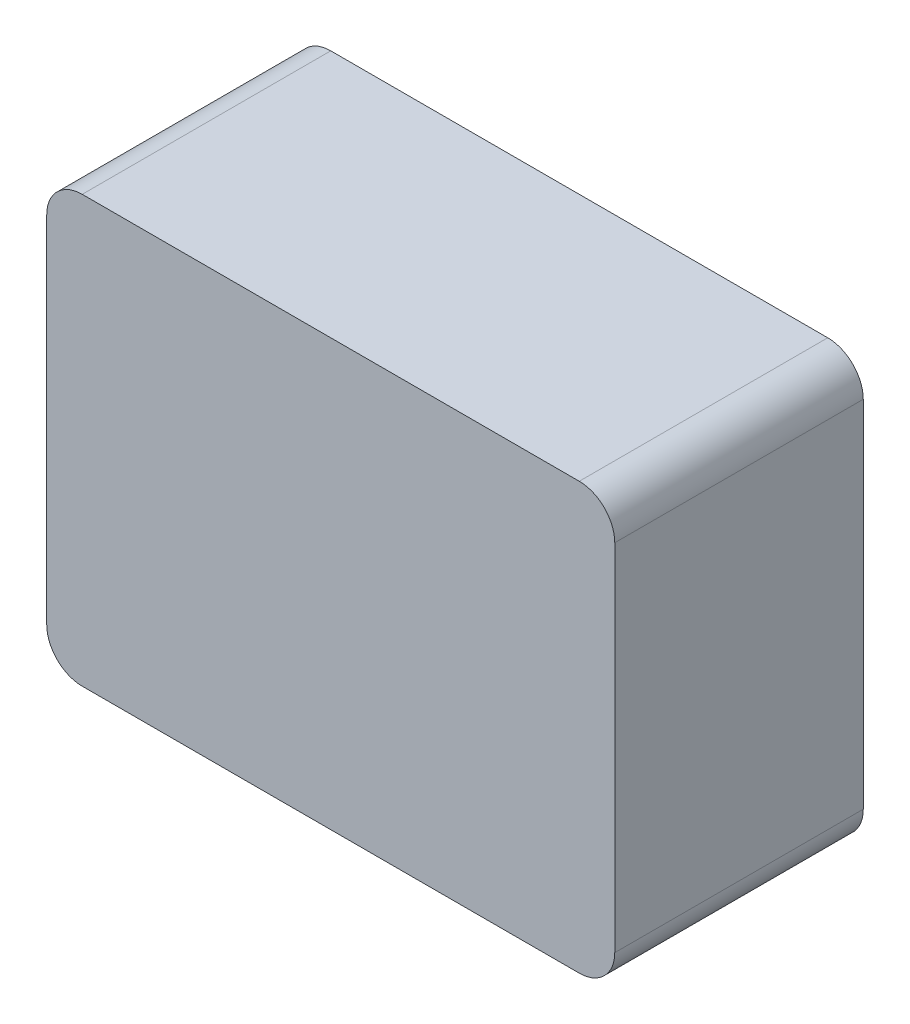
ISO-10303-21;
HEADER;
FILE_DESCRIPTION(('STEP AP214'),'2;1');
FILE_NAME('part.step','',(''),(''),'','','');
FILE_SCHEMA(('AUTOMOTIVE_DESIGN { 1 0 10303 214 1 1 1 1 }'));
ENDSEC;
DATA;
#1=APPLICATION_CONTEXT('core data for automotive mechanical design processes');
#2=APPLICATION_PROTOCOL_DEFINITION('international standard','automotive_design',2000,#1);
#3=PRODUCT_CONTEXT('',#1,'mechanical');
#4=PRODUCT('Part','Part','',(#3));
#5=PRODUCT_RELATED_PRODUCT_CATEGORY('part','',(#4));
#6=PRODUCT_DEFINITION_FORMATION('','',#4);
#7=PRODUCT_DEFINITION_CONTEXT('part definition',#1,'design');
#8=PRODUCT_DEFINITION('design','',#6,#7);
#9=PRODUCT_DEFINITION_SHAPE('','',#8);
#10=(LENGTH_UNIT() NAMED_UNIT(*) SI_UNIT(.MILLI.,.METRE.));
#11=(NAMED_UNIT(*) PLANE_ANGLE_UNIT() SI_UNIT($,.RADIAN.));
#12=(NAMED_UNIT(*) SI_UNIT($,.STERADIAN.) SOLID_ANGLE_UNIT());
#13=UNCERTAINTY_MEASURE_WITH_UNIT(LENGTH_MEASURE(1.E-05),#10,'distance_accuracy_value','');
#14=(GEOMETRIC_REPRESENTATION_CONTEXT(3) GLOBAL_UNCERTAINTY_ASSIGNED_CONTEXT((#13)) GLOBAL_UNIT_ASSIGNED_CONTEXT((#10,
#11,#12)) REPRESENTATION_CONTEXT('',''));
#15=CARTESIAN_POINT('',(0.,0.,0.));
#16=DIRECTION('',(0.,0.,1.));
#17=DIRECTION('',(1.,0.,0.));
#18=AXIS2_PLACEMENT_3D('',#15,#16,#17);
#19=CARTESIAN_POINT('',(40.,-30.,-5.));
#20=DIRECTION('',(1.,0.,0.));
#21=DIRECTION('',(0.,0.,-1.));
#22=AXIS2_PLACEMENT_3D('',#19,#20,#21);
#23=PLANE('',#22);
#24=DIRECTION('',(0.,-1.,0.));
#25=VECTOR('',#24,1.);
#26=CARTESIAN_POINT('',(40.,-30.,-35.));
#27=LINE('',#26,#25);
#28=CARTESIAN_POINT('',(40.,25.,-35.));
#29=VERTEX_POINT('',#28);
#30=CARTESIAN_POINT('',(40.,-25.,-35.));
#31=VERTEX_POINT('',#30);
#32=EDGE_CURVE('E170',#29,#31,#27,.T.);
#33=ORIENTED_EDGE('',*,*,#32,.F.);
#34=DIRECTION('',(0.,0.,1.));
#35=VECTOR('',#34,1.);
#36=CARTESIAN_POINT('',(40.,25.,-5.));
#37=LINE('',#36,#35);
#38=CARTESIAN_POINT('',(40.,25.,0.));
#39=VERTEX_POINT('',#38);
#40=EDGE_CURVE('E11',#29,#39,#37,.T.);
#41=ORIENTED_EDGE('',*,*,#40,.T.);
#42=DIRECTION('',(0.,1.,0.));
#43=VECTOR('',#42,1.);
#44=CARTESIAN_POINT('',(40.,-30.,0.));
#45=LINE('',#44,#43);
#46=CARTESIAN_POINT('',(40.,-25.,0.));
#47=VERTEX_POINT('',#46);
#48=EDGE_CURVE('E175',#47,#39,#45,.T.);
#49=ORIENTED_EDGE('',*,*,#48,.F.);
#50=DIRECTION('',(0.,0.,1.));
#51=VECTOR('',#50,1.);
#52=CARTESIAN_POINT('',(40.,-25.,-5.));
#53=LINE('',#52,#51);
#54=EDGE_CURVE('E41',#47,#31,#53,.F.);
#55=ORIENTED_EDGE('',*,*,#54,.T.);
#56=EDGE_LOOP('',(#33,#41,#49,#55));
#57=FACE_BOUND('',#56,.T.);
#58=ADVANCED_FACE('F33',(#57),#23,.T.);
#59=CARTESIAN_POINT('',(-40.,-30.,-5.));
#60=DIRECTION('',(0.,-1.,0.));
#61=DIRECTION('',(0.,0.,-1.));
#62=AXIS2_PLACEMENT_3D('',#59,#60,#61);
#63=PLANE('',#62);
#64=DIRECTION('',(1.,0.,0.));
#65=VECTOR('',#64,1.);
#66=CARTESIAN_POINT('',(-40.,-30.,0.));
#67=LINE('',#66,#65);
#68=CARTESIAN_POINT('',(-35.,-30.,0.));
#69=VERTEX_POINT('',#68);
#70=CARTESIAN_POINT('',(35.,-30.,0.));
#71=VERTEX_POINT('',#70);
#72=EDGE_CURVE('E184',#69,#71,#67,.T.);
#73=ORIENTED_EDGE('',*,*,#72,.F.);
#74=DIRECTION('',(0.,0.,1.));
#75=VECTOR('',#74,1.);
#76=CARTESIAN_POINT('',(-35.,-30.,-5.));
#77=LINE('',#76,#75);
#78=CARTESIAN_POINT('',(-35.,-30.,-35.));
#79=VERTEX_POINT('',#78);
#80=EDGE_CURVE('E203',#69,#79,#77,.F.);
#81=ORIENTED_EDGE('',*,*,#80,.T.);
#82=DIRECTION('',(-1.,0.,0.));
#83=VECTOR('',#82,1.);
#84=CARTESIAN_POINT('',(-40.,-30.,-35.));
#85=LINE('',#84,#83);
#86=CARTESIAN_POINT('',(35.,-30.,-35.));
#87=VERTEX_POINT('',#86);
#88=EDGE_CURVE('E172',#87,#79,#85,.T.);
#89=ORIENTED_EDGE('',*,*,#88,.F.);
#90=DIRECTION('',(0.,0.,1.));
#91=VECTOR('',#90,1.);
#92=CARTESIAN_POINT('',(35.,-30.,-5.));
#93=LINE('',#92,#91);
#94=EDGE_CURVE('E200',#87,#71,#93,.T.);
#95=ORIENTED_EDGE('',*,*,#94,.T.);
#96=EDGE_LOOP('',(#73,#81,#89,#95));
#97=FACE_BOUND('',#96,.T.);
#98=ADVANCED_FACE('F236',(#97),#63,.T.);
#99=CARTESIAN_POINT('',(-40.,-30.,-5.));
#100=DIRECTION('',(-1.,0.,0.));
#101=DIRECTION('',(0.,0.,1.));
#102=AXIS2_PLACEMENT_3D('',#99,#100,#101);
#103=PLANE('',#102);
#104=DIRECTION('',(0.,1.,0.));
#105=VECTOR('',#104,1.);
#106=CARTESIAN_POINT('',(-40.,30.,-35.));
#107=LINE('',#106,#105);
#108=CARTESIAN_POINT('',(-40.,-25.,-35.));
#109=VERTEX_POINT('',#108);
#110=CARTESIAN_POINT('',(-40.,25.,-35.));
#111=VERTEX_POINT('',#110);
#112=EDGE_CURVE('E143',#109,#111,#107,.T.);
#113=ORIENTED_EDGE('',*,*,#112,.F.);
#114=DIRECTION('',(0.,0.,1.));
#115=VECTOR('',#114,1.);
#116=CARTESIAN_POINT('',(-40.,-25.,-5.));
#117=LINE('',#116,#115);
#118=CARTESIAN_POINT('',(-40.,-25.,0.));
#119=VERTEX_POINT('',#118);
#120=EDGE_CURVE('E189',#109,#119,#117,.T.);
#121=ORIENTED_EDGE('',*,*,#120,.T.);
#122=DIRECTION('',(0.,-1.,0.));
#123=VECTOR('',#122,1.);
#124=CARTESIAN_POINT('',(-40.,-30.,0.));
#125=LINE('',#124,#123);
#126=CARTESIAN_POINT('',(-40.,25.,0.));
#127=VERTEX_POINT('',#126);
#128=EDGE_CURVE('E181',#127,#119,#125,.T.);
#129=ORIENTED_EDGE('',*,*,#128,.F.);
#130=DIRECTION('',(0.,0.,1.));
#131=VECTOR('',#130,1.);
#132=CARTESIAN_POINT('',(-40.,25.,-5.));
#133=LINE('',#132,#131);
#134=EDGE_CURVE('E187',#127,#111,#133,.F.);
#135=ORIENTED_EDGE('',*,*,#134,.T.);
#136=EDGE_LOOP('',(#113,#121,#129,#135));
#137=FACE_BOUND('',#136,.T.);
#138=ADVANCED_FACE('F244',(#137),#103,.T.);
#139=CARTESIAN_POINT('',(-40.,30.,-5.));
#140=DIRECTION('',(0.,1.,0.));
#141=DIRECTION('',(0.,0.,1.));
#142=AXIS2_PLACEMENT_3D('',#139,#140,#141);
#143=PLANE('',#142);
#144=DIRECTION('',(1.,0.,0.));
#145=VECTOR('',#144,1.);
#146=CARTESIAN_POINT('',(40.,30.,-35.));
#147=LINE('',#146,#145);
#148=CARTESIAN_POINT('',(-35.,30.,-35.));
#149=VERTEX_POINT('',#148);
#150=CARTESIAN_POINT('',(35.,30.,-35.));
#151=VERTEX_POINT('',#150);
#152=EDGE_CURVE('E168',#149,#151,#147,.T.);
#153=ORIENTED_EDGE('',*,*,#152,.F.);
#154=DIRECTION('',(0.,0.,1.));
#155=VECTOR('',#154,1.);
#156=CARTESIAN_POINT('',(-35.,30.,-5.));
#157=LINE('',#156,#155);
#158=CARTESIAN_POINT('',(-35.,30.,0.));
#159=VERTEX_POINT('',#158);
#160=EDGE_CURVE('E214',#149,#159,#157,.T.);
#161=ORIENTED_EDGE('',*,*,#160,.T.);
#162=DIRECTION('',(-1.,0.,0.));
#163=VECTOR('',#162,1.);
#164=CARTESIAN_POINT('',(-40.,30.,0.));
#165=LINE('',#164,#163);
#166=CARTESIAN_POINT('',(35.,30.,0.));
#167=VERTEX_POINT('',#166);
#168=EDGE_CURVE('E178',#167,#159,#165,.T.);
#169=ORIENTED_EDGE('',*,*,#168,.F.);
#170=DIRECTION('',(0.,0.,1.));
#171=VECTOR('',#170,1.);
#172=CARTESIAN_POINT('',(35.,30.,-5.));
#173=LINE('',#172,#171);
#174=EDGE_CURVE('E212',#167,#151,#173,.F.);
#175=ORIENTED_EDGE('',*,*,#174,.T.);
#176=EDGE_LOOP('',(#153,#161,#169,#175));
#177=FACE_BOUND('',#176,.T.);
#178=ADVANCED_FACE('F220',(#177),#143,.T.);
#179=CARTESIAN_POINT('',(0.,0.,0.));
#180=DIRECTION('',(0.,0.,-1.));
#181=DIRECTION('',(-1.,0.,0.));
#182=AXIS2_PLACEMENT_3D('',#179,#180,#181);
#183=PLANE('',#182);
#184=ORIENTED_EDGE('',*,*,#128,.T.);
#185=CARTESIAN_POINT('',(-35.,-25.,0.));
#186=DIRECTION('',(0.,0.,-1.));
#187=DIRECTION('',(-1.,0.,0.));
#188=AXIS2_PLACEMENT_3D('',#185,#186,#187);
#189=CIRCLE('',#188,5.);
#190=EDGE_CURVE('E198',#119,#69,#189,.F.);
#191=ORIENTED_EDGE('',*,*,#190,.T.);
#192=ORIENTED_EDGE('',*,*,#72,.T.);
#193=CARTESIAN_POINT('',(35.,-25.,0.));
#194=DIRECTION('',(0.,0.,-1.));
#195=DIRECTION('',(-1.,0.,0.));
#196=AXIS2_PLACEMENT_3D('',#193,#194,#195);
#197=CIRCLE('',#196,5.);
#198=EDGE_CURVE('E192',#71,#47,#197,.F.);
#199=ORIENTED_EDGE('',*,*,#198,.T.);
#200=ORIENTED_EDGE('',*,*,#48,.T.);
#201=CARTESIAN_POINT('',(35.,25.,0.));
#202=DIRECTION('',(0.,0.,-1.));
#203=DIRECTION('',(-1.,0.,0.));
#204=AXIS2_PLACEMENT_3D('',#201,#202,#203);
#205=CIRCLE('',#204,5.);
#206=EDGE_CURVE('E194',#39,#167,#205,.F.);
#207=ORIENTED_EDGE('',*,*,#206,.T.);
#208=ORIENTED_EDGE('',*,*,#168,.T.);
#209=CARTESIAN_POINT('',(-35.,25.,0.));
#210=DIRECTION('',(0.,0.,-1.));
#211=DIRECTION('',(-1.,0.,0.));
#212=AXIS2_PLACEMENT_3D('',#209,#210,#211);
#213=CIRCLE('',#212,5.);
#214=EDGE_CURVE('E196',#159,#127,#213,.F.);
#215=ORIENTED_EDGE('',*,*,#214,.T.);
#216=EDGE_LOOP('',(#184,#191,#192,#199,#200,#207,#208,#215));
#217=FACE_BOUND('',#216,.T.);
#218=ADVANCED_FACE('F225',(#217),#183,.F.);
#219=CARTESIAN_POINT('',(0.,0.,-35.));
#220=DIRECTION('',(0.,0.,1.));
#221=DIRECTION('',(1.,0.,0.));
#222=AXIS2_PLACEMENT_3D('',#219,#220,#221);
#223=PLANE('',#222);
#224=ORIENTED_EDGE('',*,*,#88,.T.);
#225=CARTESIAN_POINT('',(-35.,-25.,-35.));
#226=DIRECTION('',(0.,0.,1.));
#227=DIRECTION('',(1.,0.,0.));
#228=AXIS2_PLACEMENT_3D('',#225,#226,#227);
#229=CIRCLE('',#228,5.);
#230=EDGE_CURVE('E210',#79,#109,#229,.F.);
#231=ORIENTED_EDGE('',*,*,#230,.T.);
#232=ORIENTED_EDGE('',*,*,#112,.T.);
#233=CARTESIAN_POINT('',(-35.,25.,-35.));
#234=DIRECTION('',(0.,0.,1.));
#235=DIRECTION('',(1.,0.,0.));
#236=AXIS2_PLACEMENT_3D('',#233,#234,#235);
#237=CIRCLE('',#236,5.);
#238=EDGE_CURVE('E208',#111,#149,#237,.F.);
#239=ORIENTED_EDGE('',*,*,#238,.T.);
#240=ORIENTED_EDGE('',*,*,#152,.T.);
#241=CARTESIAN_POINT('',(35.,25.,-35.));
#242=DIRECTION('',(0.,0.,1.));
#243=DIRECTION('',(1.,0.,0.));
#244=AXIS2_PLACEMENT_3D('',#241,#242,#243);
#245=CIRCLE('',#244,5.);
#246=EDGE_CURVE('E54',#151,#29,#245,.F.);
#247=ORIENTED_EDGE('',*,*,#246,.T.);
#248=ORIENTED_EDGE('',*,*,#32,.T.);
#249=CARTESIAN_POINT('',(35.,-25.,-35.));
#250=DIRECTION('',(0.,0.,1.));
#251=DIRECTION('',(1.,0.,0.));
#252=AXIS2_PLACEMENT_3D('',#249,#250,#251);
#253=CIRCLE('',#252,5.);
#254=EDGE_CURVE('E205',#31,#87,#253,.F.);
#255=ORIENTED_EDGE('',*,*,#254,.T.);
#256=EDGE_LOOP('',(#224,#231,#232,#239,#240,#247,#248,#255));
#257=FACE_BOUND('',#256,.T.);
#258=DIRECTION('',(0.,1.,0.));
#259=VECTOR('',#258,1.);
#260=CARTESIAN_POINT('',(-37.5,-27.5,-35.));
#261=LINE('',#260,#259);
#262=CARTESIAN_POINT('',(-37.5,-27.5,-35.));
#263=VERTEX_POINT('',#262);
#264=CARTESIAN_POINT('',(-37.5,27.5,-35.));
#265=VERTEX_POINT('',#264);
#266=EDGE_CURVE('E124',#263,#265,#261,.T.);
#267=ORIENTED_EDGE('',*,*,#266,.F.);
#268=DIRECTION('',(-1.,0.,0.));
#269=VECTOR('',#268,1.);
#270=CARTESIAN_POINT('',(37.5,-27.5,-35.));
#271=LINE('',#270,#269);
#272=CARTESIAN_POINT('',(37.5,-27.5,-35.));
#273=VERTEX_POINT('',#272);
#274=EDGE_CURVE('E151',#273,#263,#271,.T.);
#275=ORIENTED_EDGE('',*,*,#274,.F.);
#276=DIRECTION('',(0.,-1.,0.));
#277=VECTOR('',#276,1.);
#278=CARTESIAN_POINT('',(37.5,-27.5,-35.));
#279=LINE('',#278,#277);
#280=CARTESIAN_POINT('',(37.5,27.5,-35.));
#281=VERTEX_POINT('',#280);
#282=EDGE_CURVE('E149',#281,#273,#279,.T.);
#283=ORIENTED_EDGE('',*,*,#282,.F.);
#284=DIRECTION('',(1.,0.,0.));
#285=VECTOR('',#284,1.);
#286=CARTESIAN_POINT('',(37.5,27.5,-35.));
#287=LINE('',#286,#285);
#288=EDGE_CURVE('E134',#265,#281,#287,.T.);
#289=ORIENTED_EDGE('',*,*,#288,.F.);
#290=EDGE_LOOP('',(#267,#275,#283,#289));
#291=FACE_BOUND('',#290,.T.);
#292=ADVANCED_FACE('F147',(#257,#291),#223,.F.);
#293=CARTESIAN_POINT('',(-37.5,-27.5,-35.));
#294=DIRECTION('',(1.,0.,0.));
#295=DIRECTION('',(0.,0.,-1.));
#296=AXIS2_PLACEMENT_3D('',#293,#294,#295);
#297=PLANE('',#296);
#298=DIRECTION('',(0.,1.,0.));
#299=VECTOR('',#298,1.);
#300=CARTESIAN_POINT('',(-37.5,-27.5,-5.));
#301=LINE('',#300,#299);
#302=CARTESIAN_POINT('',(-37.5,-27.5,-5.));
#303=VERTEX_POINT('',#302);
#304=CARTESIAN_POINT('',(-37.5,27.5,-5.));
#305=VERTEX_POINT('',#304);
#306=EDGE_CURVE('E155',#303,#305,#301,.T.);
#307=ORIENTED_EDGE('',*,*,#306,.F.);
#308=DIRECTION('',(0.,0.,1.));
#309=VECTOR('',#308,1.);
#310=CARTESIAN_POINT('',(-37.5,-27.5,-35.));
#311=LINE('',#310,#309);
#312=EDGE_CURVE('E130',#263,#303,#311,.T.);
#313=ORIENTED_EDGE('',*,*,#312,.F.);
#314=ORIENTED_EDGE('',*,*,#266,.T.);
#315=DIRECTION('',(0.,0.,1.));
#316=VECTOR('',#315,1.);
#317=CARTESIAN_POINT('',(-37.5,27.5,-35.));
#318=LINE('',#317,#316);
#319=EDGE_CURVE('E128',#265,#305,#318,.T.);
#320=ORIENTED_EDGE('',*,*,#319,.T.);
#321=EDGE_LOOP('',(#307,#313,#314,#320));
#322=FACE_BOUND('',#321,.T.);
#323=ADVANCED_FACE('F127',(#322),#297,.T.);
#324=CARTESIAN_POINT('',(37.5,27.5,-35.));
#325=DIRECTION('',(0.,-1.,0.));
#326=DIRECTION('',(0.,0.,-1.));
#327=AXIS2_PLACEMENT_3D('',#324,#325,#326);
#328=PLANE('',#327);
#329=DIRECTION('',(1.,0.,0.));
#330=VECTOR('',#329,1.);
#331=CARTESIAN_POINT('',(37.5,27.5,-5.));
#332=LINE('',#331,#330);
#333=CARTESIAN_POINT('',(37.5,27.5,-5.));
#334=VERTEX_POINT('',#333);
#335=EDGE_CURVE('E142',#305,#334,#332,.T.);
#336=ORIENTED_EDGE('',*,*,#335,.F.);
#337=ORIENTED_EDGE('',*,*,#319,.F.);
#338=ORIENTED_EDGE('',*,*,#288,.T.);
#339=DIRECTION('',(0.,0.,1.));
#340=VECTOR('',#339,1.);
#341=CARTESIAN_POINT('',(37.5,27.5,-35.));
#342=LINE('',#341,#340);
#343=EDGE_CURVE('E144',#281,#334,#342,.T.);
#344=ORIENTED_EDGE('',*,*,#343,.T.);
#345=EDGE_LOOP('',(#336,#337,#338,#344));
#346=FACE_BOUND('',#345,.T.);
#347=ADVANCED_FACE('F139',(#346),#328,.T.);
#348=CARTESIAN_POINT('',(37.5,-27.5,-35.));
#349=DIRECTION('',(-1.,0.,0.));
#350=DIRECTION('',(0.,0.,1.));
#351=AXIS2_PLACEMENT_3D('',#348,#349,#350);
#352=PLANE('',#351);
#353=DIRECTION('',(0.,-1.,0.));
#354=VECTOR('',#353,1.);
#355=CARTESIAN_POINT('',(37.5,-27.5,-5.));
#356=LINE('',#355,#354);
#357=CARTESIAN_POINT('',(37.5,-27.5,-5.));
#358=VERTEX_POINT('',#357);
#359=EDGE_CURVE('E158',#334,#358,#356,.T.);
#360=ORIENTED_EDGE('',*,*,#359,.F.);
#361=ORIENTED_EDGE('',*,*,#343,.F.);
#362=ORIENTED_EDGE('',*,*,#282,.T.);
#363=DIRECTION('',(0.,0.,1.));
#364=VECTOR('',#363,1.);
#365=CARTESIAN_POINT('',(37.5,-27.5,-35.));
#366=LINE('',#365,#364);
#367=EDGE_CURVE('E162',#273,#358,#366,.T.);
#368=ORIENTED_EDGE('',*,*,#367,.T.);
#369=EDGE_LOOP('',(#360,#361,#362,#368));
#370=FACE_BOUND('',#369,.T.);
#371=ADVANCED_FACE('F278',(#370),#352,.T.);
#372=CARTESIAN_POINT('',(37.5,-27.5,-35.));
#373=DIRECTION('',(0.,1.,0.));
#374=DIRECTION('',(0.,0.,1.));
#375=AXIS2_PLACEMENT_3D('',#372,#373,#374);
#376=PLANE('',#375);
#377=DIRECTION('',(-1.,0.,0.));
#378=VECTOR('',#377,1.);
#379=CARTESIAN_POINT('',(37.5,-27.5,-5.));
#380=LINE('',#379,#378);
#381=EDGE_CURVE('E135',#358,#303,#380,.T.);
#382=ORIENTED_EDGE('',*,*,#381,.F.);
#383=ORIENTED_EDGE('',*,*,#367,.F.);
#384=ORIENTED_EDGE('',*,*,#274,.T.);
#385=ORIENTED_EDGE('',*,*,#312,.T.);
#386=EDGE_LOOP('',(#382,#383,#384,#385));
#387=FACE_BOUND('',#386,.T.);
#388=ADVANCED_FACE('F270',(#387),#376,.T.);
#389=CARTESIAN_POINT('',(0.,0.,-5.));
#390=DIRECTION('',(0.,0.,-1.));
#391=DIRECTION('',(-1.,0.,0.));
#392=AXIS2_PLACEMENT_3D('',#389,#390,#391);
#393=PLANE('',#392);
#394=ORIENTED_EDGE('',*,*,#306,.T.);
#395=ORIENTED_EDGE('',*,*,#335,.T.);
#396=ORIENTED_EDGE('',*,*,#359,.T.);
#397=ORIENTED_EDGE('',*,*,#381,.T.);
#398=EDGE_LOOP('',(#394,#395,#396,#397));
#399=FACE_BOUND('',#398,.T.);
#400=ADVANCED_FACE('F253',(#399),#393,.T.);
#401=CARTESIAN_POINT('',(-35.,-25.,-5.));
#402=DIRECTION('',(0.,0.,1.));
#403=DIRECTION('',(1.,0.,0.));
#404=AXIS2_PLACEMENT_3D('',#401,#402,#403);
#405=CYLINDRICAL_SURFACE('',#404,5.);
#406=ORIENTED_EDGE('',*,*,#230,.F.);
#407=ORIENTED_EDGE('',*,*,#80,.F.);
#408=ORIENTED_EDGE('',*,*,#190,.F.);
#409=ORIENTED_EDGE('',*,*,#120,.F.);
#410=EDGE_LOOP('',(#406,#407,#408,#409));
#411=FACE_BOUND('',#410,.T.);
#412=ADVANCED_FACE('F241',(#411),#405,.T.);
#413=CARTESIAN_POINT('',(-35.,25.,-5.));
#414=DIRECTION('',(0.,0.,1.));
#415=DIRECTION('',(1.,0.,0.));
#416=AXIS2_PLACEMENT_3D('',#413,#414,#415);
#417=CYLINDRICAL_SURFACE('',#416,5.);
#418=ORIENTED_EDGE('',*,*,#238,.F.);
#419=ORIENTED_EDGE('',*,*,#134,.F.);
#420=ORIENTED_EDGE('',*,*,#214,.F.);
#421=ORIENTED_EDGE('',*,*,#160,.F.);
#422=EDGE_LOOP('',(#418,#419,#420,#421));
#423=FACE_BOUND('',#422,.T.);
#424=ADVANCED_FACE('F246',(#423),#417,.T.);
#425=CARTESIAN_POINT('',(35.,25.,-5.));
#426=DIRECTION('',(0.,0.,1.));
#427=DIRECTION('',(1.,0.,0.));
#428=AXIS2_PLACEMENT_3D('',#425,#426,#427);
#429=CYLINDRICAL_SURFACE('',#428,5.);
#430=ORIENTED_EDGE('',*,*,#246,.F.);
#431=ORIENTED_EDGE('',*,*,#174,.F.);
#432=ORIENTED_EDGE('',*,*,#206,.F.);
#433=ORIENTED_EDGE('',*,*,#40,.F.);
#434=EDGE_LOOP('',(#430,#431,#432,#433));
#435=FACE_BOUND('',#434,.T.);
#436=ADVANCED_FACE('F229',(#435),#429,.T.);
#437=CARTESIAN_POINT('',(35.,-25.,-5.));
#438=DIRECTION('',(0.,0.,1.));
#439=DIRECTION('',(1.,0.,0.));
#440=AXIS2_PLACEMENT_3D('',#437,#438,#439);
#441=CYLINDRICAL_SURFACE('',#440,5.);
#442=ORIENTED_EDGE('',*,*,#254,.F.);
#443=ORIENTED_EDGE('',*,*,#54,.F.);
#444=ORIENTED_EDGE('',*,*,#198,.F.);
#445=ORIENTED_EDGE('',*,*,#94,.F.);
#446=EDGE_LOOP('',(#442,#443,#444,#445));
#447=FACE_BOUND('',#446,.T.);
#448=ADVANCED_FACE('F35',(#447),#441,.T.);
#449=CLOSED_SHELL('',(#58,#98,#138,#178,#218,#292,#323,#347,#371,#388,#400,#412,#424,#436,#448));
#450=MANIFOLD_SOLID_BREP('B2',#449);
#451=ADVANCED_BREP_SHAPE_REPRESENTATION('',(#18,#450),#14);
#452=SHAPE_DEFINITION_REPRESENTATION(#9,#451);
ENDSEC;
END-ISO-10303-21;
